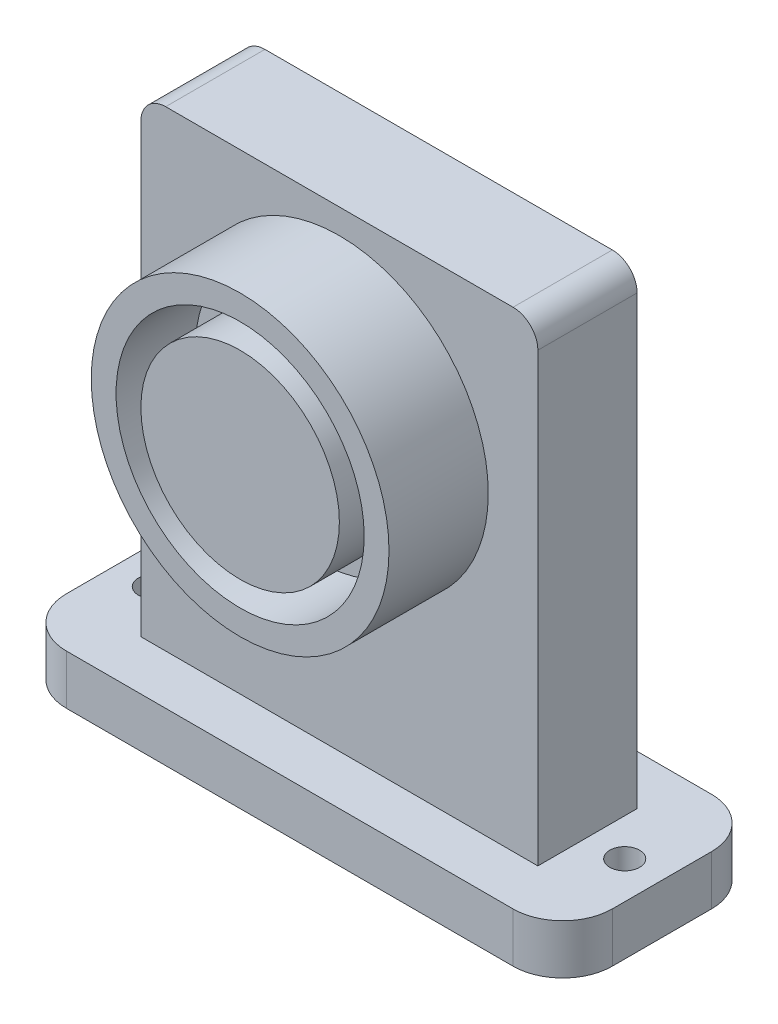
ISO-10303-21;
HEADER;
FILE_DESCRIPTION(('STEP AP214'),'2;1');
FILE_NAME('part.step','',(''),(''),'','','');
FILE_SCHEMA(('AUTOMOTIVE_DESIGN { 1 0 10303 214 1 1 1 1 }'));
ENDSEC;
DATA;
#1=APPLICATION_CONTEXT('core data for automotive mechanical design processes');
#2=APPLICATION_PROTOCOL_DEFINITION('international standard','automotive_design',2000,#1);
#3=PRODUCT_CONTEXT('',#1,'mechanical');
#4=PRODUCT('Part','Part','',(#3));
#5=PRODUCT_RELATED_PRODUCT_CATEGORY('part','',(#4));
#6=PRODUCT_DEFINITION_FORMATION('','',#4);
#7=PRODUCT_DEFINITION_CONTEXT('part definition',#1,'design');
#8=PRODUCT_DEFINITION('design','',#6,#7);
#9=PRODUCT_DEFINITION_SHAPE('','',#8);
#10=(LENGTH_UNIT() NAMED_UNIT(*) SI_UNIT(.MILLI.,.METRE.));
#11=(NAMED_UNIT(*) PLANE_ANGLE_UNIT() SI_UNIT($,.RADIAN.));
#12=(NAMED_UNIT(*) SI_UNIT($,.STERADIAN.) SOLID_ANGLE_UNIT());
#13=UNCERTAINTY_MEASURE_WITH_UNIT(LENGTH_MEASURE(1.E-05),#10,'distance_accuracy_value','');
#14=(GEOMETRIC_REPRESENTATION_CONTEXT(3) GLOBAL_UNCERTAINTY_ASSIGNED_CONTEXT((#13)) GLOBAL_UNIT_ASSIGNED_CONTEXT((#10,
#11,#12)) REPRESENTATION_CONTEXT('',''));
#15=CARTESIAN_POINT('',(0.,0.,0.));
#16=DIRECTION('',(0.,0.,1.));
#17=DIRECTION('',(1.,0.,0.));
#18=AXIS2_PLACEMENT_3D('',#15,#16,#17);
#19=CARTESIAN_POINT('',(20.,35.,10.));
#20=DIRECTION('',(-1.,0.,0.));
#21=DIRECTION('',(0.,-1.,0.));
#22=AXIS2_PLACEMENT_3D('',#19,#20,#21);
#23=PLANE('',#22);
#24=DIRECTION('',(0.,1.,0.));
#25=VECTOR('',#24,1.);
#26=CARTESIAN_POINT('',(20.,35.,10.));
#27=LINE('',#26,#25);
#28=CARTESIAN_POINT('',(20.,-30.,10.));
#29=VERTEX_POINT('',#28);
#30=CARTESIAN_POINT('',(20.,15.,10.));
#31=VERTEX_POINT('',#30);
#32=EDGE_CURVE('E147',#29,#31,#27,.T.);
#33=ORIENTED_EDGE('',*,*,#32,.F.);
#34=DIRECTION('',(0.,0.,1.));
#35=VECTOR('',#34,1.);
#36=CARTESIAN_POINT('',(20.,-30.,10.));
#37=LINE('',#36,#35);
#38=CARTESIAN_POINT('',(20.,-30.,0.));
#39=VERTEX_POINT('',#38);
#40=EDGE_CURVE('E135',#39,#29,#37,.T.);
#41=ORIENTED_EDGE('',*,*,#40,.F.);
#42=DIRECTION('',(0.,1.,0.));
#43=VECTOR('',#42,1.);
#44=CARTESIAN_POINT('',(20.,35.,0.));
#45=LINE('',#44,#43);
#46=CARTESIAN_POINT('',(20.,15.,0.));
#47=VERTEX_POINT('',#46);
#48=EDGE_CURVE('E159',#39,#47,#45,.T.);
#49=ORIENTED_EDGE('',*,*,#48,.T.);
#50=DIRECTION('',(0.,0.,-1.));
#51=VECTOR('',#50,1.);
#52=CARTESIAN_POINT('',(20.,15.,10.));
#53=LINE('',#52,#51);
#54=EDGE_CURVE('E152',#47,#31,#53,.F.);
#55=ORIENTED_EDGE('',*,*,#54,.T.);
#56=EDGE_LOOP('',(#33,#41,#49,#55));
#57=FACE_BOUND('',#56,.T.);
#58=ADVANCED_FACE('F36',(#57),#23,.F.);
#59=CARTESIAN_POINT('',(-20.,35.,10.));
#60=DIRECTION('',(1.,0.,0.));
#61=DIRECTION('',(0.,1.,0.));
#62=AXIS2_PLACEMENT_3D('',#59,#60,#61);
#63=PLANE('',#62);
#64=DIRECTION('',(0.,-1.,0.));
#65=VECTOR('',#64,1.);
#66=CARTESIAN_POINT('',(-20.,35.,0.));
#67=LINE('',#66,#65);
#68=CARTESIAN_POINT('',(-20.,15.,0.));
#69=VERTEX_POINT('',#68);
#70=CARTESIAN_POINT('',(-20.,-30.,0.));
#71=VERTEX_POINT('',#70);
#72=EDGE_CURVE('E154',#69,#71,#67,.T.);
#73=ORIENTED_EDGE('',*,*,#72,.T.);
#74=DIRECTION('',(0.,0.,-1.));
#75=VECTOR('',#74,1.);
#76=CARTESIAN_POINT('',(-20.,-30.,10.));
#77=LINE('',#76,#75);
#78=CARTESIAN_POINT('',(-20.,-30.,10.));
#79=VERTEX_POINT('',#78);
#80=EDGE_CURVE('E51',#79,#71,#77,.T.);
#81=ORIENTED_EDGE('',*,*,#80,.F.);
#82=DIRECTION('',(0.,-1.,0.));
#83=VECTOR('',#82,1.);
#84=CARTESIAN_POINT('',(-20.,35.,10.));
#85=LINE('',#84,#83);
#86=CARTESIAN_POINT('',(-20.,15.,10.));
#87=VERTEX_POINT('',#86);
#88=EDGE_CURVE('E149',#87,#79,#85,.T.);
#89=ORIENTED_EDGE('',*,*,#88,.F.);
#90=DIRECTION('',(0.,0.,1.));
#91=VECTOR('',#90,1.);
#92=CARTESIAN_POINT('',(-20.,15.,0.));
#93=LINE('',#92,#91);
#94=EDGE_CURVE('E11',#87,#69,#93,.F.);
#95=ORIENTED_EDGE('',*,*,#94,.T.);
#96=EDGE_LOOP('',(#73,#81,#89,#95));
#97=FACE_BOUND('',#96,.T.);
#98=ADVANCED_FACE('F221',(#97),#63,.F.);
#99=CARTESIAN_POINT('',(0.,0.,10.));
#100=DIRECTION('',(0.,0.,1.));
#101=DIRECTION('',(1.,0.,0.));
#102=AXIS2_PLACEMENT_3D('',#99,#100,#101);
#103=PLANE('',#102);
#104=DIRECTION('',(-1.,0.,0.));
#105=VECTOR('',#104,1.);
#106=CARTESIAN_POINT('',(-20.,-30.,10.));
#107=LINE('',#106,#105);
#108=EDGE_CURVE('E139',#29,#79,#107,.T.);
#109=ORIENTED_EDGE('',*,*,#108,.F.);
#110=ORIENTED_EDGE('',*,*,#32,.T.);
#111=CARTESIAN_POINT('',(17.5,15.,10.));
#112=DIRECTION('',(0.,0.,1.));
#113=DIRECTION('',(1.,0.,0.));
#114=AXIS2_PLACEMENT_3D('',#111,#112,#113);
#115=CIRCLE('',#114,2.5);
#116=CARTESIAN_POINT('',(17.5,17.5,10.));
#117=VERTEX_POINT('',#116);
#118=EDGE_CURVE('E44',#31,#117,#115,.T.);
#119=ORIENTED_EDGE('',*,*,#118,.T.);
#120=DIRECTION('',(1.,0.,0.));
#121=VECTOR('',#120,1.);
#122=CARTESIAN_POINT('',(-20.,17.5,10.));
#123=LINE('',#122,#121);
#124=CARTESIAN_POINT('',(-17.5,17.5,10.));
#125=VERTEX_POINT('',#124);
#126=EDGE_CURVE('E179',#125,#117,#123,.T.);
#127=ORIENTED_EDGE('',*,*,#126,.F.);
#128=CARTESIAN_POINT('',(-17.5,15.,10.));
#129=DIRECTION('',(0.,0.,1.));
#130=DIRECTION('',(1.,0.,0.));
#131=AXIS2_PLACEMENT_3D('',#128,#129,#130);
#132=CIRCLE('',#131,2.5);
#133=EDGE_CURVE('E59',#125,#87,#132,.T.);
#134=ORIENTED_EDGE('',*,*,#133,.T.);
#135=ORIENTED_EDGE('',*,*,#88,.T.);
#136=EDGE_LOOP('',(#109,#110,#119,#127,#134,#135));
#137=FACE_BOUND('',#136,.T.);
#138=CARTESIAN_POINT('',(0.,0.,10.));
#139=DIRECTION('',(0.,0.,1.));
#140=DIRECTION('',(1.,0.,0.));
#141=AXIS2_PLACEMENT_3D('',#138,#139,#140);
#142=CIRCLE('',#141,15.);
#143=CARTESIAN_POINT('',(15.,0.,10.));
#144=VERTEX_POINT('',#143);
#145=EDGE_CURVE('E156',#144,#144,#142,.T.);
#146=ORIENTED_EDGE('',*,*,#145,.F.);
#147=EDGE_LOOP('',(#146));
#148=FACE_BOUND('',#147,.T.);
#149=ADVANCED_FACE('F145',(#137,#148),#103,.T.);
#150=CARTESIAN_POINT('',(0.,0.,0.));
#151=DIRECTION('',(0.,0.,1.));
#152=DIRECTION('',(1.,0.,0.));
#153=AXIS2_PLACEMENT_3D('',#150,#151,#152);
#154=PLANE('',#153);
#155=ORIENTED_EDGE('',*,*,#48,.F.);
#156=DIRECTION('',(1.,0.,0.));
#157=VECTOR('',#156,1.);
#158=CARTESIAN_POINT('',(-20.,-30.,0.));
#159=LINE('',#158,#157);
#160=EDGE_CURVE('E140',#71,#39,#159,.T.);
#161=ORIENTED_EDGE('',*,*,#160,.F.);
#162=ORIENTED_EDGE('',*,*,#72,.F.);
#163=CARTESIAN_POINT('',(-17.5,15.,0.));
#164=DIRECTION('',(0.,0.,1.));
#165=DIRECTION('',(1.,0.,0.));
#166=AXIS2_PLACEMENT_3D('',#163,#164,#165);
#167=CIRCLE('',#166,2.5);
#168=CARTESIAN_POINT('',(-17.5,17.5,0.));
#169=VERTEX_POINT('',#168);
#170=EDGE_CURVE('E172',#69,#169,#167,.F.);
#171=ORIENTED_EDGE('',*,*,#170,.T.);
#172=DIRECTION('',(-1.,0.,0.));
#173=VECTOR('',#172,1.);
#174=CARTESIAN_POINT('',(-20.,17.5,0.));
#175=LINE('',#174,#173);
#176=CARTESIAN_POINT('',(17.5,17.5,0.));
#177=VERTEX_POINT('',#176);
#178=EDGE_CURVE('E187',#177,#169,#175,.T.);
#179=ORIENTED_EDGE('',*,*,#178,.F.);
#180=CARTESIAN_POINT('',(17.5,15.,0.));
#181=DIRECTION('',(0.,0.,1.));
#182=DIRECTION('',(1.,0.,0.));
#183=AXIS2_PLACEMENT_3D('',#180,#181,#182);
#184=CIRCLE('',#183,2.5);
#185=EDGE_CURVE('E174',#177,#47,#184,.F.);
#186=ORIENTED_EDGE('',*,*,#185,.T.);
#187=EDGE_LOOP('',(#155,#161,#162,#171,#179,#186));
#188=FACE_BOUND('',#187,.T.);
#189=ADVANCED_FACE('F192',(#188),#154,.F.);
#190=CARTESIAN_POINT('',(0.,0.,20.));
#191=DIRECTION('',(0.,0.,-1.));
#192=DIRECTION('',(-1.,0.,0.));
#193=AXIS2_PLACEMENT_3D('',#190,#191,#192);
#194=CYLINDRICAL_SURFACE('',#193,15.);
#195=CARTESIAN_POINT('',(0.,0.,20.));
#196=DIRECTION('',(0.,0.,1.));
#197=DIRECTION('',(1.,0.,0.));
#198=AXIS2_PLACEMENT_3D('',#195,#196,#197);
#199=CIRCLE('',#198,15.);
#200=CARTESIAN_POINT('',(15.,0.,20.));
#201=VERTEX_POINT('',#200);
#202=EDGE_CURVE('E164',#201,#201,#199,.T.);
#203=ORIENTED_EDGE('',*,*,#202,.F.);
#204=EDGE_LOOP('',(#203));
#205=FACE_BOUND('',#204,.T.);
#206=ORIENTED_EDGE('',*,*,#145,.T.);
#207=EDGE_LOOP('',(#206));
#208=FACE_BOUND('',#207,.T.);
#209=ADVANCED_FACE('F214',(#205,#208),#194,.T.);
#210=CARTESIAN_POINT('',(0.,0.,20.));
#211=DIRECTION('',(0.,0.,1.));
#212=DIRECTION('',(1.,0.,0.));
#213=AXIS2_PLACEMENT_3D('',#210,#211,#212);
#214=PLANE('',#213);
#215=CARTESIAN_POINT('',(0.,0.,20.));
#216=DIRECTION('',(0.,0.,1.));
#217=DIRECTION('',(1.,0.,0.));
#218=AXIS2_PLACEMENT_3D('',#215,#216,#217);
#219=CIRCLE('',#218,12.5);
#220=CARTESIAN_POINT('',(12.5,0.,20.));
#221=VERTEX_POINT('',#220);
#222=EDGE_CURVE('E203',#221,#221,#219,.T.);
#223=ORIENTED_EDGE('',*,*,#222,.F.);
#224=EDGE_LOOP('',(#223));
#225=FACE_BOUND('',#224,.T.);
#226=ORIENTED_EDGE('',*,*,#202,.T.);
#227=EDGE_LOOP('',(#226));
#228=FACE_BOUND('',#227,.T.);
#229=ADVANCED_FACE('F212',(#225,#228),#214,.T.);
#230=CARTESIAN_POINT('',(0.,0.,12.));
#231=DIRECTION('',(0.,0.,1.));
#232=DIRECTION('',(1.,0.,0.));
#233=AXIS2_PLACEMENT_3D('',#230,#231,#232);
#234=CYLINDRICAL_SURFACE('',#233,12.5);
#235=CARTESIAN_POINT('',(0.,0.,12.));
#236=DIRECTION('',(0.,0.,1.));
#237=DIRECTION('',(1.,0.,0.));
#238=AXIS2_PLACEMENT_3D('',#235,#236,#237);
#239=CIRCLE('',#238,12.5);
#240=CARTESIAN_POINT('',(12.5,0.,12.));
#241=VERTEX_POINT('',#240);
#242=EDGE_CURVE('E205',#241,#241,#239,.T.);
#243=ORIENTED_EDGE('',*,*,#242,.F.);
#244=EDGE_LOOP('',(#243));
#245=FACE_BOUND('',#244,.T.);
#246=ORIENTED_EDGE('',*,*,#222,.T.);
#247=EDGE_LOOP('',(#246));
#248=FACE_BOUND('',#247,.T.);
#249=ADVANCED_FACE('F259',(#245,#248),#234,.F.);
#250=CARTESIAN_POINT('',(0.,0.,12.));
#251=DIRECTION('',(0.,0.,1.));
#252=DIRECTION('',(1.,0.,0.));
#253=AXIS2_PLACEMENT_3D('',#250,#251,#252);
#254=PLANE('',#253);
#255=CARTESIAN_POINT('',(0.,0.,12.));
#256=DIRECTION('',(0.,0.,1.));
#257=DIRECTION('',(1.,0.,0.));
#258=AXIS2_PLACEMENT_3D('',#255,#256,#257);
#259=CIRCLE('',#258,10.);
#260=CARTESIAN_POINT('',(10.,0.,12.));
#261=VERTEX_POINT('',#260);
#262=EDGE_CURVE('E198',#261,#261,#259,.T.);
#263=ORIENTED_EDGE('',*,*,#262,.F.);
#264=EDGE_LOOP('',(#263));
#265=FACE_BOUND('',#264,.T.);
#266=ORIENTED_EDGE('',*,*,#242,.T.);
#267=EDGE_LOOP('',(#266));
#268=FACE_BOUND('',#267,.T.);
#269=ADVANCED_FACE('F255',(#265,#268),#254,.T.);
#270=CARTESIAN_POINT('',(0.,0.,12.));
#271=DIRECTION('',(0.,0.,1.));
#272=DIRECTION('',(1.,0.,0.));
#273=AXIS2_PLACEMENT_3D('',#270,#271,#272);
#274=CYLINDRICAL_SURFACE('',#273,10.);
#275=ORIENTED_EDGE('',*,*,#262,.T.);
#276=EDGE_LOOP('',(#275));
#277=FACE_BOUND('',#276,.T.);
#278=CARTESIAN_POINT('',(0.,0.,20.));
#279=DIRECTION('',(0.,0.,1.));
#280=DIRECTION('',(1.,0.,0.));
#281=AXIS2_PLACEMENT_3D('',#278,#279,#280);
#282=CIRCLE('',#281,10.);
#283=CARTESIAN_POINT('',(10.,0.,20.));
#284=VERTEX_POINT('',#283);
#285=EDGE_CURVE('E195',#284,#284,#282,.T.);
#286=ORIENTED_EDGE('',*,*,#285,.F.);
#287=EDGE_LOOP('',(#286));
#288=FACE_BOUND('',#287,.T.);
#289=ADVANCED_FACE('F247',(#277,#288),#274,.T.);
#290=ORIENTED_EDGE('',*,*,#285,.T.);
#291=EDGE_LOOP('',(#290));
#292=FACE_BOUND('',#291,.T.);
#293=ADVANCED_FACE('F242',(#292),#214,.T.);
#294=CARTESIAN_POINT('',(0.,17.5,0.));
#295=DIRECTION('',(0.,1.,0.));
#296=DIRECTION('',(0.,0.,1.));
#297=AXIS2_PLACEMENT_3D('',#294,#295,#296);
#298=PLANE('',#297);
#299=ORIENTED_EDGE('',*,*,#126,.T.);
#300=DIRECTION('',(0.,0.,-1.));
#301=VECTOR('',#300,1.);
#302=CARTESIAN_POINT('',(17.5,17.5,0.));
#303=LINE('',#302,#301);
#304=EDGE_CURVE('E169',#117,#177,#303,.T.);
#305=ORIENTED_EDGE('',*,*,#304,.T.);
#306=ORIENTED_EDGE('',*,*,#178,.T.);
#307=DIRECTION('',(0.,0.,1.));
#308=VECTOR('',#307,1.);
#309=CARTESIAN_POINT('',(-17.5,17.5,10.));
#310=LINE('',#309,#308);
#311=EDGE_CURVE('E166',#169,#125,#310,.T.);
#312=ORIENTED_EDGE('',*,*,#311,.T.);
#313=EDGE_LOOP('',(#299,#305,#306,#312));
#314=FACE_BOUND('',#313,.T.);
#315=ADVANCED_FACE('F183',(#314),#298,.T.);
#316=CARTESIAN_POINT('',(17.5,15.,0.));
#317=DIRECTION('',(0.,0.,1.));
#318=DIRECTION('',(1.,0.,0.));
#319=AXIS2_PLACEMENT_3D('',#316,#317,#318);
#320=CYLINDRICAL_SURFACE('',#319,2.5);
#321=ORIENTED_EDGE('',*,*,#118,.F.);
#322=ORIENTED_EDGE('',*,*,#54,.F.);
#323=ORIENTED_EDGE('',*,*,#185,.F.);
#324=ORIENTED_EDGE('',*,*,#304,.F.);
#325=EDGE_LOOP('',(#321,#322,#323,#324));
#326=FACE_BOUND('',#325,.T.);
#327=ADVANCED_FACE('F190',(#326),#320,.T.);
#328=CARTESIAN_POINT('',(-17.5,15.,0.));
#329=DIRECTION('',(0.,0.,-1.));
#330=DIRECTION('',(-1.,0.,0.));
#331=AXIS2_PLACEMENT_3D('',#328,#329,#330);
#332=CYLINDRICAL_SURFACE('',#331,2.5);
#333=ORIENTED_EDGE('',*,*,#170,.F.);
#334=ORIENTED_EDGE('',*,*,#94,.F.);
#335=ORIENTED_EDGE('',*,*,#133,.F.);
#336=ORIENTED_EDGE('',*,*,#311,.F.);
#337=EDGE_LOOP('',(#333,#334,#335,#336));
#338=FACE_BOUND('',#337,.T.);
#339=ADVANCED_FACE('F38',(#338),#332,.T.);
#340=CARTESIAN_POINT('',(22.5,-30.,10.));
#341=DIRECTION('',(0.,-1.,0.));
#342=DIRECTION('',(1.,0.,0.));
#343=AXIS2_PLACEMENT_3D('',#340,#341,#342);
#344=CYLINDRICAL_SURFACE('',#343,5.);
#345=CARTESIAN_POINT('',(22.5,-35.,10.));
#346=DIRECTION('',(0.,-1.,0.));
#347=DIRECTION('',(-1.,0.,0.));
#348=AXIS2_PLACEMENT_3D('',#345,#346,#347);
#349=CIRCLE('',#348,5.);
#350=CARTESIAN_POINT('',(27.5,-35.,10.));
#351=VERTEX_POINT('',#350);
#352=CARTESIAN_POINT('',(22.5,-35.,15.));
#353=VERTEX_POINT('',#352);
#354=EDGE_CURVE('E460',#351,#353,#349,.T.);
#355=ORIENTED_EDGE('',*,*,#354,.F.);
#356=DIRECTION('',(0.,-1.,0.));
#357=VECTOR('',#356,1.);
#358=CARTESIAN_POINT('',(27.5,-30.,10.));
#359=LINE('',#358,#357);
#360=CARTESIAN_POINT('',(27.5,-30.,10.));
#361=VERTEX_POINT('',#360);
#362=EDGE_CURVE('E188',#361,#351,#359,.T.);
#363=ORIENTED_EDGE('',*,*,#362,.F.);
#364=CARTESIAN_POINT('',(22.5,-30.,10.));
#365=DIRECTION('',(0.,-1.,0.));
#366=DIRECTION('',(-1.,0.,0.));
#367=AXIS2_PLACEMENT_3D('',#364,#365,#366);
#368=CIRCLE('',#367,5.);
#369=CARTESIAN_POINT('',(22.5,-30.,15.));
#370=VERTEX_POINT('',#369);
#371=EDGE_CURVE('E490',#361,#370,#368,.T.);
#372=ORIENTED_EDGE('',*,*,#371,.T.);
#373=DIRECTION('',(0.,-1.,0.));
#374=VECTOR('',#373,1.);
#375=CARTESIAN_POINT('',(22.5,-30.,15.));
#376=LINE('',#375,#374);
#377=EDGE_CURVE('E503',#370,#353,#376,.T.);
#378=ORIENTED_EDGE('',*,*,#377,.T.);
#379=EDGE_LOOP('',(#355,#363,#372,#378));
#380=FACE_BOUND('',#379,.T.);
#381=ADVANCED_FACE('F240',(#380),#344,.T.);
#382=CARTESIAN_POINT('',(27.5,-30.,10.));
#383=DIRECTION('',(1.,0.,0.));
#384=DIRECTION('',(0.,1.,0.));
#385=AXIS2_PLACEMENT_3D('',#382,#383,#384);
#386=PLANE('',#385);
#387=DIRECTION('',(0.,0.,1.));
#388=VECTOR('',#387,1.);
#389=CARTESIAN_POINT('',(27.5,-35.,10.));
#390=LINE('',#389,#388);
#391=CARTESIAN_POINT('',(27.5,-35.,0.));
#392=VERTEX_POINT('',#391);
#393=EDGE_CURVE('E466',#392,#351,#390,.T.);
#394=ORIENTED_EDGE('',*,*,#393,.F.);
#395=DIRECTION('',(0.,-1.,0.));
#396=VECTOR('',#395,1.);
#397=CARTESIAN_POINT('',(27.5,-30.,0.));
#398=LINE('',#397,#396);
#399=CARTESIAN_POINT('',(27.5,-30.,0.));
#400=VERTEX_POINT('',#399);
#401=EDGE_CURVE('E492',#400,#392,#398,.T.);
#402=ORIENTED_EDGE('',*,*,#401,.F.);
#403=DIRECTION('',(0.,0.,1.));
#404=VECTOR('',#403,1.);
#405=CARTESIAN_POINT('',(27.5,-30.,10.));
#406=LINE('',#405,#404);
#407=EDGE_CURVE('E474',#400,#361,#406,.T.);
#408=ORIENTED_EDGE('',*,*,#407,.T.);
#409=ORIENTED_EDGE('',*,*,#362,.T.);
#410=EDGE_LOOP('',(#394,#402,#408,#409));
#411=FACE_BOUND('',#410,.T.);
#412=ADVANCED_FACE('F330',(#411),#386,.T.);
#413=CARTESIAN_POINT('',(22.5,-30.,0.));
#414=DIRECTION('',(0.,-1.,0.));
#415=DIRECTION('',(1.,0.,0.));
#416=AXIS2_PLACEMENT_3D('',#413,#414,#415);
#417=CYLINDRICAL_SURFACE('',#416,5.);
#418=CARTESIAN_POINT('',(22.5,-35.,0.));
#419=DIRECTION('',(0.,-1.,0.));
#420=DIRECTION('',(1.,0.,0.));
#421=AXIS2_PLACEMENT_3D('',#418,#419,#420);
#422=CIRCLE('',#421,5.);
#423=CARTESIAN_POINT('',(22.5,-35.,-5.));
#424=VERTEX_POINT('',#423);
#425=EDGE_CURVE('E487',#424,#392,#422,.T.);
#426=ORIENTED_EDGE('',*,*,#425,.F.);
#427=DIRECTION('',(0.,-1.,0.));
#428=VECTOR('',#427,1.);
#429=CARTESIAN_POINT('',(22.5,-30.,-5.));
#430=LINE('',#429,#428);
#431=CARTESIAN_POINT('',(22.5,-30.,-5.));
#432=VERTEX_POINT('',#431);
#433=EDGE_CURVE('E494',#432,#424,#430,.T.);
#434=ORIENTED_EDGE('',*,*,#433,.F.);
#435=CARTESIAN_POINT('',(22.5,-30.,0.));
#436=DIRECTION('',(0.,-1.,0.));
#437=DIRECTION('',(1.,0.,0.));
#438=AXIS2_PLACEMENT_3D('',#435,#436,#437);
#439=CIRCLE('',#438,5.);
#440=EDGE_CURVE('E506',#432,#400,#439,.T.);
#441=ORIENTED_EDGE('',*,*,#440,.T.);
#442=ORIENTED_EDGE('',*,*,#401,.T.);
#443=EDGE_LOOP('',(#426,#434,#441,#442));
#444=FACE_BOUND('',#443,.T.);
#445=ADVANCED_FACE('F339',(#444),#417,.T.);
#446=CARTESIAN_POINT('',(-22.5,-30.,-5.));
#447=DIRECTION('',(0.,0.,-1.));
#448=DIRECTION('',(-1.,0.,0.));
#449=AXIS2_PLACEMENT_3D('',#446,#447,#448);
#450=PLANE('',#449);
#451=DIRECTION('',(1.,0.,0.));
#452=VECTOR('',#451,1.);
#453=CARTESIAN_POINT('',(-22.5,-35.,-5.));
#454=LINE('',#453,#452);
#455=CARTESIAN_POINT('',(-22.5,-35.,-5.));
#456=VERTEX_POINT('',#455);
#457=EDGE_CURVE('E484',#456,#424,#454,.T.);
#458=ORIENTED_EDGE('',*,*,#457,.F.);
#459=DIRECTION('',(0.,-1.,0.));
#460=VECTOR('',#459,1.);
#461=CARTESIAN_POINT('',(-22.5,-30.,-5.));
#462=LINE('',#461,#460);
#463=CARTESIAN_POINT('',(-22.5,-30.,-5.));
#464=VERTEX_POINT('',#463);
#465=EDGE_CURVE('E496',#464,#456,#462,.T.);
#466=ORIENTED_EDGE('',*,*,#465,.F.);
#467=DIRECTION('',(1.,0.,0.));
#468=VECTOR('',#467,1.);
#469=CARTESIAN_POINT('',(-22.5,-30.,-5.));
#470=LINE('',#469,#468);
#471=EDGE_CURVE('E509',#464,#432,#470,.T.);
#472=ORIENTED_EDGE('',*,*,#471,.T.);
#473=ORIENTED_EDGE('',*,*,#433,.T.);
#474=EDGE_LOOP('',(#458,#466,#472,#473));
#475=FACE_BOUND('',#474,.T.);
#476=ADVANCED_FACE('F349',(#475),#450,.T.);
#477=CARTESIAN_POINT('',(-22.5,-30.,0.));
#478=DIRECTION('',(0.,-1.,0.));
#479=DIRECTION('',(1.,0.,0.));
#480=AXIS2_PLACEMENT_3D('',#477,#478,#479);
#481=CYLINDRICAL_SURFACE('',#480,5.);
#482=CARTESIAN_POINT('',(-22.5,-35.,0.));
#483=DIRECTION('',(0.,-1.,0.));
#484=DIRECTION('',(1.,0.,0.));
#485=AXIS2_PLACEMENT_3D('',#482,#483,#484);
#486=CIRCLE('',#485,5.);
#487=CARTESIAN_POINT('',(-27.5,-35.,0.));
#488=VERTEX_POINT('',#487);
#489=EDGE_CURVE('E481',#488,#456,#486,.T.);
#490=ORIENTED_EDGE('',*,*,#489,.F.);
#491=DIRECTION('',(0.,-1.,0.));
#492=VECTOR('',#491,1.);
#493=CARTESIAN_POINT('',(-27.5,-30.,0.));
#494=LINE('',#493,#492);
#495=CARTESIAN_POINT('',(-27.5,-30.,0.));
#496=VERTEX_POINT('',#495);
#497=EDGE_CURVE('E498',#496,#488,#494,.T.);
#498=ORIENTED_EDGE('',*,*,#497,.F.);
#499=CARTESIAN_POINT('',(-22.5,-30.,0.));
#500=DIRECTION('',(0.,-1.,0.));
#501=DIRECTION('',(1.,0.,0.));
#502=AXIS2_PLACEMENT_3D('',#499,#500,#501);
#503=CIRCLE('',#502,5.);
#504=EDGE_CURVE('E512',#496,#464,#503,.T.);
#505=ORIENTED_EDGE('',*,*,#504,.T.);
#506=ORIENTED_EDGE('',*,*,#465,.T.);
#507=EDGE_LOOP('',(#490,#498,#505,#506));
#508=FACE_BOUND('',#507,.T.);
#509=ADVANCED_FACE('F359',(#508),#481,.T.);
#510=CARTESIAN_POINT('',(-27.5,-30.,10.));
#511=DIRECTION('',(-1.,0.,0.));
#512=DIRECTION('',(0.,-1.,0.));
#513=AXIS2_PLACEMENT_3D('',#510,#511,#512);
#514=PLANE('',#513);
#515=DIRECTION('',(0.,0.,-1.));
#516=VECTOR('',#515,1.);
#517=CARTESIAN_POINT('',(-27.5,-35.,10.));
#518=LINE('',#517,#516);
#519=CARTESIAN_POINT('',(-27.5,-35.,10.));
#520=VERTEX_POINT('',#519);
#521=EDGE_CURVE('E478',#520,#488,#518,.T.);
#522=ORIENTED_EDGE('',*,*,#521,.F.);
#523=DIRECTION('',(0.,-1.,0.));
#524=VECTOR('',#523,1.);
#525=CARTESIAN_POINT('',(-27.5,-30.,10.));
#526=LINE('',#525,#524);
#527=CARTESIAN_POINT('',(-27.5,-30.,10.));
#528=VERTEX_POINT('',#527);
#529=EDGE_CURVE('E500',#528,#520,#526,.T.);
#530=ORIENTED_EDGE('',*,*,#529,.F.);
#531=DIRECTION('',(0.,0.,-1.));
#532=VECTOR('',#531,1.);
#533=CARTESIAN_POINT('',(-27.5,-30.,10.));
#534=LINE('',#533,#532);
#535=EDGE_CURVE('E517',#528,#496,#534,.T.);
#536=ORIENTED_EDGE('',*,*,#535,.T.);
#537=ORIENTED_EDGE('',*,*,#497,.T.);
#538=EDGE_LOOP('',(#522,#530,#536,#537));
#539=FACE_BOUND('',#538,.T.);
#540=ADVANCED_FACE('F369',(#539),#514,.T.);
#541=CARTESIAN_POINT('',(-22.5,-30.,10.));
#542=DIRECTION('',(0.,-1.,0.));
#543=DIRECTION('',(1.,0.,0.));
#544=AXIS2_PLACEMENT_3D('',#541,#542,#543);
#545=CYLINDRICAL_SURFACE('',#544,5.);
#546=CARTESIAN_POINT('',(-22.5,-35.,10.));
#547=DIRECTION('',(0.,-1.,0.));
#548=DIRECTION('',(1.,0.,0.));
#549=AXIS2_PLACEMENT_3D('',#546,#547,#548);
#550=CIRCLE('',#549,5.);
#551=CARTESIAN_POINT('',(-22.5,-35.,15.));
#552=VERTEX_POINT('',#551);
#553=EDGE_CURVE('E469',#552,#520,#550,.T.);
#554=ORIENTED_EDGE('',*,*,#553,.F.);
#555=DIRECTION('',(0.,-1.,0.));
#556=VECTOR('',#555,1.);
#557=CARTESIAN_POINT('',(-22.5,-30.,15.));
#558=LINE('',#557,#556);
#559=CARTESIAN_POINT('',(-22.5,-30.,15.));
#560=VERTEX_POINT('',#559);
#561=EDGE_CURVE('E502',#560,#552,#558,.T.);
#562=ORIENTED_EDGE('',*,*,#561,.F.);
#563=CARTESIAN_POINT('',(-22.5,-30.,10.));
#564=DIRECTION('',(0.,-1.,0.));
#565=DIRECTION('',(1.,0.,0.));
#566=AXIS2_PLACEMENT_3D('',#563,#564,#565);
#567=CIRCLE('',#566,5.);
#568=EDGE_CURVE('E520',#560,#528,#567,.T.);
#569=ORIENTED_EDGE('',*,*,#568,.T.);
#570=ORIENTED_EDGE('',*,*,#529,.T.);
#571=EDGE_LOOP('',(#554,#562,#569,#570));
#572=FACE_BOUND('',#571,.T.);
#573=ADVANCED_FACE('F379',(#572),#545,.T.);
#574=CARTESIAN_POINT('',(-22.5,-30.,15.));
#575=DIRECTION('',(0.,0.,1.));
#576=DIRECTION('',(1.,0.,0.));
#577=AXIS2_PLACEMENT_3D('',#574,#575,#576);
#578=PLANE('',#577);
#579=DIRECTION('',(-1.,0.,0.));
#580=VECTOR('',#579,1.);
#581=CARTESIAN_POINT('',(-22.5,-35.,15.));
#582=LINE('',#581,#580);
#583=EDGE_CURVE('E463',#353,#552,#582,.T.);
#584=ORIENTED_EDGE('',*,*,#583,.F.);
#585=ORIENTED_EDGE('',*,*,#377,.F.);
#586=DIRECTION('',(-1.,0.,0.));
#587=VECTOR('',#586,1.);
#588=CARTESIAN_POINT('',(-22.5,-30.,15.));
#589=LINE('',#588,#587);
#590=EDGE_CURVE('E523',#370,#560,#589,.T.);
#591=ORIENTED_EDGE('',*,*,#590,.T.);
#592=ORIENTED_EDGE('',*,*,#561,.T.);
#593=EDGE_LOOP('',(#584,#585,#591,#592));
#594=FACE_BOUND('',#593,.T.);
#595=ADVANCED_FACE('F389',(#594),#578,.T.);
#596=CARTESIAN_POINT('',(22.5,-30.,10.));
#597=DIRECTION('',(0.,1.,0.));
#598=DIRECTION('',(-1.,0.,0.));
#599=AXIS2_PLACEMENT_3D('',#596,#597,#598);
#600=PLANE('',#599);
#601=ORIENTED_EDGE('',*,*,#40,.T.);
#602=ORIENTED_EDGE('',*,*,#108,.T.);
#603=ORIENTED_EDGE('',*,*,#80,.T.);
#604=ORIENTED_EDGE('',*,*,#160,.T.);
#605=EDGE_LOOP('',(#601,#602,#603,#604));
#606=FACE_BOUND('',#605,.T.);
#607=CARTESIAN_POINT('',(23.75,-30.,4.99999999999993));
#608=DIRECTION('',(0.,-1.,0.));
#609=DIRECTION('',(-1.,0.,0.));
#610=AXIS2_PLACEMENT_3D('',#607,#608,#609);
#611=CIRCLE('',#610,1.5);
#612=CARTESIAN_POINT('',(22.25,-30.,4.99999999999993));
#613=VERTEX_POINT('',#612);
#614=EDGE_CURVE('E527',#613,#613,#611,.T.);
#615=ORIENTED_EDGE('',*,*,#614,.T.);
#616=EDGE_LOOP('',(#615));
#617=FACE_BOUND('',#616,.T.);
#618=CARTESIAN_POINT('',(-23.75,-30.,5.));
#619=DIRECTION('',(0.,-1.,0.));
#620=DIRECTION('',(1.,0.,0.));
#621=AXIS2_PLACEMENT_3D('',#618,#619,#620);
#622=CIRCLE('',#621,1.5);
#623=CARTESIAN_POINT('',(-22.25,-30.,5.));
#624=VERTEX_POINT('',#623);
#625=EDGE_CURVE('E467',#624,#624,#622,.T.);
#626=ORIENTED_EDGE('',*,*,#625,.T.);
#627=EDGE_LOOP('',(#626));
#628=FACE_BOUND('',#627,.T.);
#629=ORIENTED_EDGE('',*,*,#371,.F.);
#630=ORIENTED_EDGE('',*,*,#407,.F.);
#631=ORIENTED_EDGE('',*,*,#440,.F.);
#632=ORIENTED_EDGE('',*,*,#471,.F.);
#633=ORIENTED_EDGE('',*,*,#504,.F.);
#634=ORIENTED_EDGE('',*,*,#535,.F.);
#635=ORIENTED_EDGE('',*,*,#568,.F.);
#636=ORIENTED_EDGE('',*,*,#590,.F.);
#637=EDGE_LOOP('',(#629,#630,#631,#632,#633,#634,#635,#636));
#638=FACE_BOUND('',#637,.T.);
#639=ADVANCED_FACE('F137',(#606,#617,#628,#638),#600,.T.);
#640=CARTESIAN_POINT('',(-23.75,-30.,5.));
#641=DIRECTION('',(0.,-1.,0.));
#642=DIRECTION('',(1.,0.,0.));
#643=AXIS2_PLACEMENT_3D('',#640,#641,#642);
#644=CYLINDRICAL_SURFACE('',#643,1.5);
#645=ORIENTED_EDGE('',*,*,#625,.F.);
#646=EDGE_LOOP('',(#645));
#647=FACE_BOUND('',#646,.T.);
#648=CARTESIAN_POINT('',(-23.75,-35.,5.));
#649=DIRECTION('',(0.,-1.,0.));
#650=DIRECTION('',(1.,0.,0.));
#651=AXIS2_PLACEMENT_3D('',#648,#649,#650);
#652=CIRCLE('',#651,1.5);
#653=CARTESIAN_POINT('',(-22.25,-35.,5.));
#654=VERTEX_POINT('',#653);
#655=EDGE_CURVE('E455',#654,#654,#652,.T.);
#656=ORIENTED_EDGE('',*,*,#655,.T.);
#657=EDGE_LOOP('',(#656));
#658=FACE_BOUND('',#657,.T.);
#659=ADVANCED_FACE('F407',(#647,#658),#644,.F.);
#660=CARTESIAN_POINT('',(23.75,-30.,4.99999999999993));
#661=DIRECTION('',(0.,-1.,0.));
#662=DIRECTION('',(1.,0.,0.));
#663=AXIS2_PLACEMENT_3D('',#660,#661,#662);
#664=CYLINDRICAL_SURFACE('',#663,1.5);
#665=ORIENTED_EDGE('',*,*,#614,.F.);
#666=EDGE_LOOP('',(#665));
#667=FACE_BOUND('',#666,.T.);
#668=CARTESIAN_POINT('',(23.75,-35.,4.99999999999993));
#669=DIRECTION('',(0.,-1.,0.));
#670=DIRECTION('',(-1.,0.,0.));
#671=AXIS2_PLACEMENT_3D('',#668,#669,#670);
#672=CIRCLE('',#671,1.5);
#673=CARTESIAN_POINT('',(22.25,-35.,4.99999999999993));
#674=VERTEX_POINT('',#673);
#675=EDGE_CURVE('E451',#674,#674,#672,.T.);
#676=ORIENTED_EDGE('',*,*,#675,.T.);
#677=EDGE_LOOP('',(#676));
#678=FACE_BOUND('',#677,.T.);
#679=ADVANCED_FACE('F416',(#667,#678),#664,.F.);
#680=CARTESIAN_POINT('',(-20.,-35.,10.));
#681=DIRECTION('',(0.,1.,0.));
#682=DIRECTION('',(-1.,0.,0.));
#683=AXIS2_PLACEMENT_3D('',#680,#681,#682);
#684=PLANE('',#683);
#685=ORIENTED_EDGE('',*,*,#675,.F.);
#686=EDGE_LOOP('',(#685));
#687=FACE_BOUND('',#686,.T.);
#688=ORIENTED_EDGE('',*,*,#655,.F.);
#689=EDGE_LOOP('',(#688));
#690=FACE_BOUND('',#689,.T.);
#691=ORIENTED_EDGE('',*,*,#354,.T.);
#692=ORIENTED_EDGE('',*,*,#583,.T.);
#693=ORIENTED_EDGE('',*,*,#553,.T.);
#694=ORIENTED_EDGE('',*,*,#521,.T.);
#695=ORIENTED_EDGE('',*,*,#489,.T.);
#696=ORIENTED_EDGE('',*,*,#457,.T.);
#697=ORIENTED_EDGE('',*,*,#425,.T.);
#698=ORIENTED_EDGE('',*,*,#393,.T.);
#699=EDGE_LOOP('',(#691,#692,#693,#694,#695,#696,#697,#698));
#700=FACE_BOUND('',#699,.T.);
#701=ADVANCED_FACE('F426',(#687,#690,#700),#684,.F.);
#702=CLOSED_SHELL('',(#58,#98,#149,#189,#209,#229,#249,#269,#289,#293,#315,#327,#339,#381,#412,
#445,#476,#509,#540,#573,#595,#639,#659,#679,#701));
#703=MANIFOLD_SOLID_BREP('B2',#702);
#704=ADVANCED_BREP_SHAPE_REPRESENTATION('',(#18,#703),#14);
#705=SHAPE_DEFINITION_REPRESENTATION(#9,#704);
ENDSEC;
END-ISO-10303-21;
